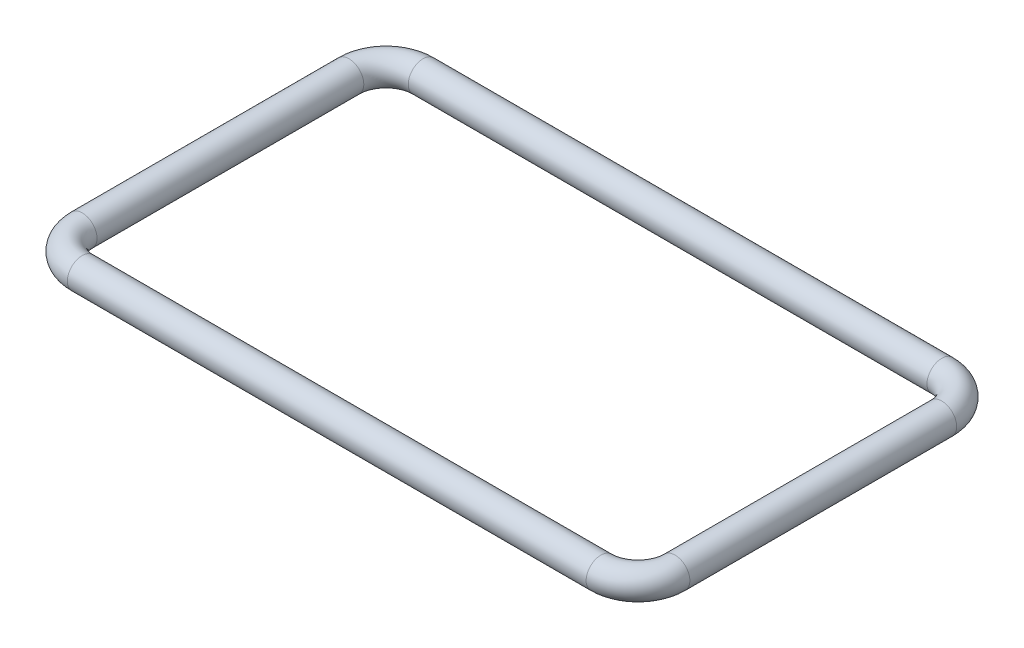
ISO-10303-21;
HEADER;
FILE_DESCRIPTION(('STEP AP214'),'2;1');
FILE_NAME('part.step','',(''),(''),'','','');
FILE_SCHEMA(('AUTOMOTIVE_DESIGN { 1 0 10303 214 1 1 1 1 }'));
ENDSEC;
DATA;
#1=APPLICATION_CONTEXT('core data for automotive mechanical design processes');
#2=APPLICATION_PROTOCOL_DEFINITION('international standard','automotive_design',2000,#1);
#3=PRODUCT_CONTEXT('',#1,'mechanical');
#4=PRODUCT('Part','Part','',(#3));
#5=PRODUCT_RELATED_PRODUCT_CATEGORY('part','',(#4));
#6=PRODUCT_DEFINITION_FORMATION('','',#4);
#7=PRODUCT_DEFINITION_CONTEXT('part definition',#1,'design');
#8=PRODUCT_DEFINITION('design','',#6,#7);
#9=PRODUCT_DEFINITION_SHAPE('','',#8);
#10=(LENGTH_UNIT() NAMED_UNIT(*) SI_UNIT(.MILLI.,.METRE.));
#11=(NAMED_UNIT(*) PLANE_ANGLE_UNIT() SI_UNIT($,.RADIAN.));
#12=(NAMED_UNIT(*) SI_UNIT($,.STERADIAN.) SOLID_ANGLE_UNIT());
#13=UNCERTAINTY_MEASURE_WITH_UNIT(LENGTH_MEASURE(1.E-05),#10,'distance_accuracy_value','');
#14=(GEOMETRIC_REPRESENTATION_CONTEXT(3) GLOBAL_UNCERTAINTY_ASSIGNED_CONTEXT((#13)) GLOBAL_UNIT_ASSIGNED_CONTEXT((#10,
#11,#12)) REPRESENTATION_CONTEXT('',''));
#15=CARTESIAN_POINT('',(0.,0.,0.));
#16=DIRECTION('',(0.,0.,1.));
#17=DIRECTION('',(1.,0.,0.));
#18=AXIS2_PLACEMENT_3D('',#15,#16,#17);
#19=CARTESIAN_POINT('',(0.,0.,-29.21));
#20=DIRECTION('',(-1.,0.,0.));
#21=DIRECTION('',(0.,0.,1.));
#22=AXIS2_PLACEMENT_3D('',#19,#20,#21);
#23=CYLINDRICAL_SURFACE('',#22,1.27);
#24=CARTESIAN_POINT('',(-22.225,0.,-29.21));
#25=DIRECTION('',(-1.,0.,0.));
#26=DIRECTION('',(0.,0.,1.));
#27=AXIS2_PLACEMENT_3D('',#24,#25,#26);
#28=CIRCLE('',#27,1.27);
#29=CARTESIAN_POINT('',(-22.225,0.,-30.48));
#30=VERTEX_POINT('',#29);
#31=EDGE_CURVE('E73',#30,#30,#28,.T.);
#32=ORIENTED_EDGE('',*,*,#31,.F.);
#33=EDGE_LOOP('',(#32));
#34=FACE_BOUND('',#33,.T.);
#35=CARTESIAN_POINT('',(22.225,0.,-29.21));
#36=DIRECTION('',(-1.,0.,0.));
#37=DIRECTION('',(0.,0.,1.));
#38=AXIS2_PLACEMENT_3D('',#35,#36,#37);
#39=CIRCLE('',#38,1.27);
#40=CARTESIAN_POINT('',(22.225,0.,-30.48));
#41=VERTEX_POINT('',#40);
#42=EDGE_CURVE('E87',#41,#41,#39,.F.);
#43=ORIENTED_EDGE('',*,*,#42,.F.);
#44=EDGE_LOOP('',(#43));
#45=FACE_BOUND('',#44,.T.);
#46=ADVANCED_FACE('F58',(#34,#45),#23,.T.);
#47=CARTESIAN_POINT('',(-22.225,0.,-26.035));
#48=DIRECTION('',(0.,1.,0.));
#49=DIRECTION('',(0.,0.,1.));
#50=AXIS2_PLACEMENT_3D('',#47,#48,#49);
#51=TOROIDAL_SURFACE('',#50,3.175,1.27);
#52=CARTESIAN_POINT('',(-25.4,0.,-26.035));
#53=DIRECTION('',(0.,0.,1.));
#54=DIRECTION('',(1.,0.,0.));
#55=AXIS2_PLACEMENT_3D('',#52,#53,#54);
#56=CIRCLE('',#55,1.27);
#57=CARTESIAN_POINT('',(-26.67,0.,-26.035));
#58=VERTEX_POINT('',#57);
#59=EDGE_CURVE('E69',#58,#58,#56,.T.);
#60=CARTESIAN_POINT('',(-22.225,0.,-26.035));
#61=DIRECTION('',(0.,1.,0.));
#62=DIRECTION('',(0.,0.,1.));
#63=AXIS2_PLACEMENT_3D('',#60,#61,#62);
#64=CIRCLE('',#63,4.445);
#65=EDGE_CURVE('',#30,#58,#64,.T.);
#66=ORIENTED_EDGE('',*,*,#31,.T.);
#67=ORIENTED_EDGE('',*,*,#59,.F.);
#68=ORIENTED_EDGE('',*,*,#65,.T.);
#69=ORIENTED_EDGE('',*,*,#65,.F.);
#70=EDGE_LOOP('',(#66,#68,#67,#69));
#71=FACE_BOUND('',#70,.T.);
#72=ADVANCED_FACE('F94',(#71),#51,.T.);
#73=CARTESIAN_POINT('',(-25.4,0.,-26.035));
#74=DIRECTION('',(0.,0.,1.));
#75=DIRECTION('',(1.,0.,0.));
#76=AXIS2_PLACEMENT_3D('',#73,#74,#75);
#77=CYLINDRICAL_SURFACE('',#76,1.27);
#78=CARTESIAN_POINT('',(-25.4,0.,-3.175));
#79=DIRECTION('',(0.,0.,1.));
#80=DIRECTION('',(1.,0.,0.));
#81=AXIS2_PLACEMENT_3D('',#78,#79,#80);
#82=CIRCLE('',#81,1.27);
#83=CARTESIAN_POINT('',(-26.67,0.,-3.175));
#84=VERTEX_POINT('',#83);
#85=EDGE_CURVE('E65',#84,#84,#82,.T.);
#86=ORIENTED_EDGE('',*,*,#85,.F.);
#87=EDGE_LOOP('',(#86));
#88=FACE_BOUND('',#87,.T.);
#89=ORIENTED_EDGE('',*,*,#59,.T.);
#90=EDGE_LOOP('',(#89));
#91=FACE_BOUND('',#90,.T.);
#92=ADVANCED_FACE('F101',(#88,#91),#77,.T.);
#93=CARTESIAN_POINT('',(-22.225,0.,-3.175));
#94=DIRECTION('',(0.,1.,0.));
#95=DIRECTION('',(0.,0.,1.));
#96=AXIS2_PLACEMENT_3D('',#93,#94,#95);
#97=TOROIDAL_SURFACE('',#96,3.175,1.27);
#98=CARTESIAN_POINT('',(-22.225,0.,0.));
#99=DIRECTION('',(1.,0.,0.));
#100=DIRECTION('',(0.,0.,-1.));
#101=AXIS2_PLACEMENT_3D('',#98,#99,#100);
#102=CIRCLE('',#101,1.27);
#103=CARTESIAN_POINT('',(-22.225,0.,1.27));
#104=VERTEX_POINT('',#103);
#105=EDGE_CURVE('E11',#104,#104,#102,.T.);
#106=CARTESIAN_POINT('',(-22.225,0.,-3.175));
#107=DIRECTION('',(0.,1.,0.));
#108=DIRECTION('',(0.,0.,1.));
#109=AXIS2_PLACEMENT_3D('',#106,#107,#108);
#110=CIRCLE('',#109,4.445);
#111=EDGE_CURVE('',#84,#104,#110,.T.);
#112=ORIENTED_EDGE('',*,*,#85,.T.);
#113=ORIENTED_EDGE('',*,*,#105,.F.);
#114=ORIENTED_EDGE('',*,*,#111,.T.);
#115=ORIENTED_EDGE('',*,*,#111,.F.);
#116=EDGE_LOOP('',(#112,#114,#113,#115));
#117=FACE_BOUND('',#116,.T.);
#118=ADVANCED_FACE('F110',(#117),#97,.T.);
#119=CARTESIAN_POINT('',(-22.225,0.,0.));
#120=DIRECTION('',(1.,0.,0.));
#121=DIRECTION('',(0.,0.,-1.));
#122=AXIS2_PLACEMENT_3D('',#119,#120,#121);
#123=CYLINDRICAL_SURFACE('',#122,1.27);
#124=ORIENTED_EDGE('',*,*,#105,.T.);
#125=EDGE_LOOP('',(#124));
#126=FACE_BOUND('',#125,.T.);
#127=CARTESIAN_POINT('',(22.225,0.,0.));
#128=DIRECTION('',(1.,0.,0.));
#129=DIRECTION('',(0.,0.,-1.));
#130=AXIS2_PLACEMENT_3D('',#127,#128,#129);
#131=CIRCLE('',#130,1.27);
#132=CARTESIAN_POINT('',(22.225,0.,1.27));
#133=VERTEX_POINT('',#132);
#134=EDGE_CURVE('E78',#133,#133,#131,.F.);
#135=ORIENTED_EDGE('',*,*,#134,.T.);
#136=EDGE_LOOP('',(#135));
#137=FACE_BOUND('',#136,.T.);
#138=ADVANCED_FACE('F60',(#126,#137),#123,.T.);
#139=CARTESIAN_POINT('',(22.225,0.,-26.035));
#140=DIRECTION('',(0.,-1.,0.));
#141=DIRECTION('',(0.,0.,-1.));
#142=AXIS2_PLACEMENT_3D('',#139,#140,#141);
#143=TOROIDAL_SURFACE('',#142,3.175,1.27);
#144=CARTESIAN_POINT('',(25.4,0.,-26.035));
#145=DIRECTION('',(0.,0.,-1.));
#146=DIRECTION('',(-1.,0.,0.));
#147=AXIS2_PLACEMENT_3D('',#144,#145,#146);
#148=CIRCLE('',#147,1.27);
#149=CARTESIAN_POINT('',(26.67,0.,-26.035));
#150=VERTEX_POINT('',#149);
#151=EDGE_CURVE('E84',#150,#150,#148,.F.);
#152=CARTESIAN_POINT('',(22.225,0.,-26.035));
#153=DIRECTION('',(0.,-1.,0.));
#154=DIRECTION('',(0.,0.,-1.));
#155=AXIS2_PLACEMENT_3D('',#152,#153,#154);
#156=CIRCLE('',#155,4.445);
#157=EDGE_CURVE('',#41,#150,#156,.T.);
#158=ORIENTED_EDGE('',*,*,#42,.T.);
#159=ORIENTED_EDGE('',*,*,#151,.F.);
#160=ORIENTED_EDGE('',*,*,#157,.T.);
#161=ORIENTED_EDGE('',*,*,#157,.F.);
#162=EDGE_LOOP('',(#158,#160,#159,#161));
#163=FACE_BOUND('',#162,.T.);
#164=ADVANCED_FACE('F91',(#163),#143,.T.);
#165=CARTESIAN_POINT('',(25.4,0.,-26.035));
#166=DIRECTION('',(0.,0.,1.));
#167=DIRECTION('',(1.,0.,0.));
#168=AXIS2_PLACEMENT_3D('',#165,#166,#167);
#169=CYLINDRICAL_SURFACE('',#168,1.27);
#170=CARTESIAN_POINT('',(25.4,0.,-3.175));
#171=DIRECTION('',(0.,0.,-1.));
#172=DIRECTION('',(-1.,0.,0.));
#173=AXIS2_PLACEMENT_3D('',#170,#171,#172);
#174=CIRCLE('',#173,1.27);
#175=CARTESIAN_POINT('',(26.67,0.,-3.175));
#176=VERTEX_POINT('',#175);
#177=EDGE_CURVE('E81',#176,#176,#174,.F.);
#178=ORIENTED_EDGE('',*,*,#177,.F.);
#179=EDGE_LOOP('',(#178));
#180=FACE_BOUND('',#179,.T.);
#181=ORIENTED_EDGE('',*,*,#151,.T.);
#182=EDGE_LOOP('',(#181));
#183=FACE_BOUND('',#182,.T.);
#184=ADVANCED_FACE('F107',(#180,#183),#169,.T.);
#185=CARTESIAN_POINT('',(22.225,0.,-3.175));
#186=DIRECTION('',(0.,-1.,0.));
#187=DIRECTION('',(0.,0.,-1.));
#188=AXIS2_PLACEMENT_3D('',#185,#186,#187);
#189=TOROIDAL_SURFACE('',#188,3.175,1.27);
#190=CARTESIAN_POINT('',(22.225,0.,-3.175));
#191=DIRECTION('',(0.,-1.,0.));
#192=DIRECTION('',(0.,0.,-1.));
#193=AXIS2_PLACEMENT_3D('',#190,#191,#192);
#194=CIRCLE('',#193,4.445);
#195=EDGE_CURVE('',#176,#133,#194,.T.);
#196=ORIENTED_EDGE('',*,*,#177,.T.);
#197=ORIENTED_EDGE('',*,*,#134,.F.);
#198=ORIENTED_EDGE('',*,*,#195,.T.);
#199=ORIENTED_EDGE('',*,*,#195,.F.);
#200=EDGE_LOOP('',(#196,#198,#197,#199));
#201=FACE_BOUND('',#200,.T.);
#202=ADVANCED_FACE('F97',(#201),#189,.T.);
#203=CLOSED_SHELL('',(#46,#72,#92,#118,#138,#164,#184,#202));
#204=MANIFOLD_SOLID_BREP('B2',#203);
#205=ADVANCED_BREP_SHAPE_REPRESENTATION('',(#18,#204),#14);
#206=SHAPE_DEFINITION_REPRESENTATION(#9,#205);
ENDSEC;
END-ISO-10303-21;
